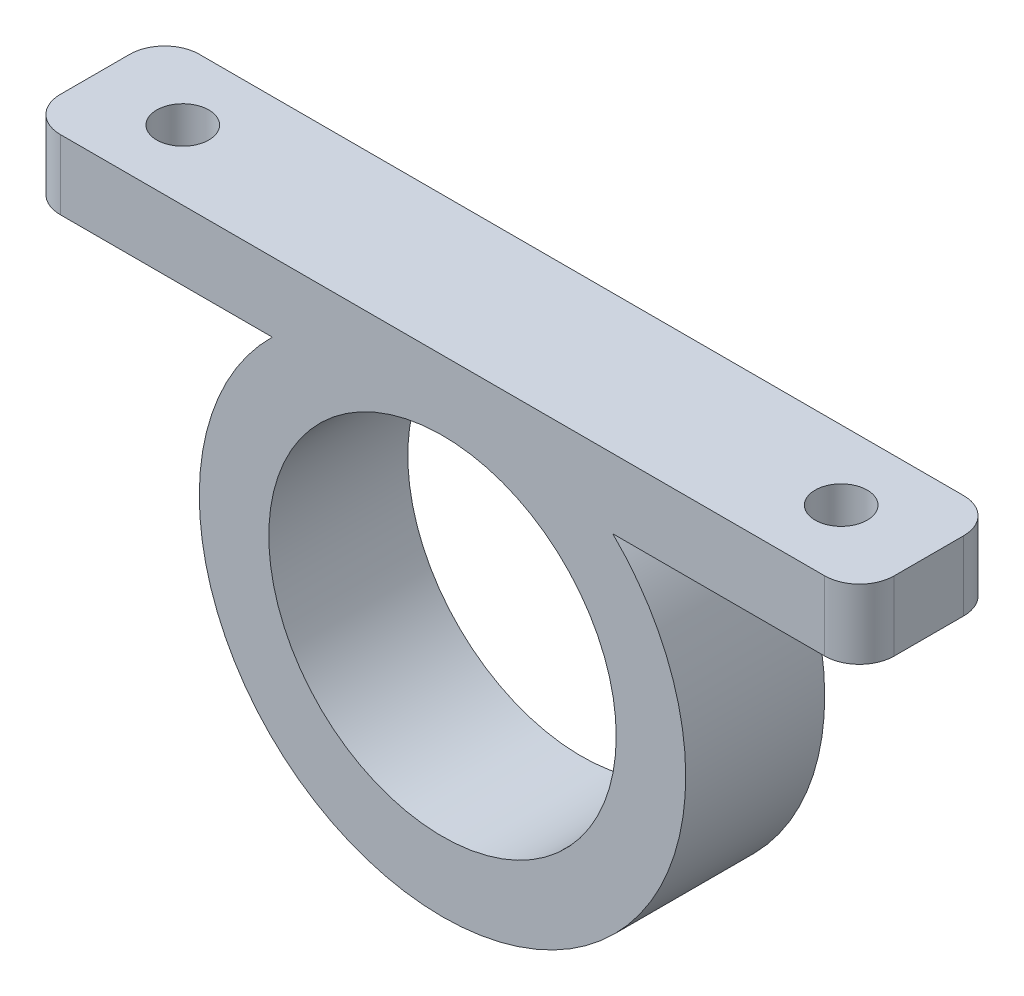
ISO-10303-21;
HEADER;
FILE_DESCRIPTION(('STEP AP214'),'2;1');
FILE_NAME('part.step','',(''),(''),'','','');
FILE_SCHEMA(('AUTOMOTIVE_DESIGN { 1 0 10303 214 1 1 1 1 }'));
ENDSEC;
DATA;
#1=APPLICATION_CONTEXT('core data for automotive mechanical design processes');
#2=APPLICATION_PROTOCOL_DEFINITION('international standard','automotive_design',2000,#1);
#3=PRODUCT_CONTEXT('',#1,'mechanical');
#4=PRODUCT('Part','Part','',(#3));
#5=PRODUCT_RELATED_PRODUCT_CATEGORY('part','',(#4));
#6=PRODUCT_DEFINITION_FORMATION('','',#4);
#7=PRODUCT_DEFINITION_CONTEXT('part definition',#1,'design');
#8=PRODUCT_DEFINITION('design','',#6,#7);
#9=PRODUCT_DEFINITION_SHAPE('','',#8);
#10=(LENGTH_UNIT() NAMED_UNIT(*) SI_UNIT(.MILLI.,.METRE.));
#11=(NAMED_UNIT(*) PLANE_ANGLE_UNIT() SI_UNIT($,.RADIAN.));
#12=(NAMED_UNIT(*) SI_UNIT($,.STERADIAN.) SOLID_ANGLE_UNIT());
#13=UNCERTAINTY_MEASURE_WITH_UNIT(LENGTH_MEASURE(1.E-05),#10,'distance_accuracy_value','');
#14=(GEOMETRIC_REPRESENTATION_CONTEXT(3) GLOBAL_UNCERTAINTY_ASSIGNED_CONTEXT((#13)) GLOBAL_UNIT_ASSIGNED_CONTEXT((#10,
#11,#12)) REPRESENTATION_CONTEXT('',''));
#15=CARTESIAN_POINT('',(0.,0.,0.));
#16=DIRECTION('',(0.,0.,1.));
#17=DIRECTION('',(1.,0.,0.));
#18=AXIS2_PLACEMENT_3D('',#15,#16,#17);
#19=CARTESIAN_POINT('',(0.,0.,8.));
#20=DIRECTION('',(0.,0.,1.));
#21=DIRECTION('',(1.,0.,0.));
#22=AXIS2_PLACEMENT_3D('',#19,#20,#21);
#23=PLANE('',#22);
#24=DIRECTION('',(1.,0.,0.));
#25=VECTOR('',#24,1.);
#26=CARTESIAN_POINT('',(24.,10.,8.));
#27=LINE('',#26,#25);
#28=CARTESIAN_POINT('',(9.79795897113272,9.99999999999999,8.));
#29=VERTEX_POINT('',#28);
#30=CARTESIAN_POINT('',(22.,10.,8.));
#31=VERTEX_POINT('',#30);
#32=EDGE_CURVE('E108',#29,#31,#27,.T.);
#33=ORIENTED_EDGE('',*,*,#32,.T.);
#34=DIRECTION('',(0.,1.,0.));
#35=VECTOR('',#34,1.);
#36=CARTESIAN_POINT('',(22.,14.,8.));
#37=LINE('',#36,#35);
#38=CARTESIAN_POINT('',(22.,14.,8.));
#39=VERTEX_POINT('',#38);
#40=EDGE_CURVE('E139',#31,#39,#37,.T.);
#41=ORIENTED_EDGE('',*,*,#40,.T.);
#42=DIRECTION('',(-1.,0.,0.));
#43=VECTOR('',#42,1.);
#44=CARTESIAN_POINT('',(0.,14.,8.));
#45=LINE('',#44,#43);
#46=CARTESIAN_POINT('',(-22.,14.,8.));
#47=VERTEX_POINT('',#46);
#48=EDGE_CURVE('E121',#39,#47,#45,.T.);
#49=ORIENTED_EDGE('',*,*,#48,.T.);
#50=DIRECTION('',(0.,-1.,0.));
#51=VECTOR('',#50,1.);
#52=CARTESIAN_POINT('',(-22.,10.,8.));
#53=LINE('',#52,#51);
#54=CARTESIAN_POINT('',(-22.,10.,8.));
#55=VERTEX_POINT('',#54);
#56=EDGE_CURVE('E136',#47,#55,#53,.T.);
#57=ORIENTED_EDGE('',*,*,#56,.T.);
#58=DIRECTION('',(1.,0.,0.));
#59=VECTOR('',#58,1.);
#60=CARTESIAN_POINT('',(-24.,10.,8.));
#61=LINE('',#60,#59);
#62=CARTESIAN_POINT('',(-9.79795897113272,10.,8.));
#63=VERTEX_POINT('',#62);
#64=EDGE_CURVE('E127',#55,#63,#61,.T.);
#65=ORIENTED_EDGE('',*,*,#64,.T.);
#66=CARTESIAN_POINT('',(0.,0.,8.));
#67=DIRECTION('',(0.,0.,1.));
#68=DIRECTION('',(1.,0.,0.));
#69=AXIS2_PLACEMENT_3D('',#66,#67,#68);
#70=CIRCLE('',#69,14.);
#71=EDGE_CURVE('E122',#63,#29,#70,.T.);
#72=ORIENTED_EDGE('',*,*,#71,.T.);
#73=EDGE_LOOP('',(#33,#41,#49,#57,#65,#72));
#74=FACE_BOUND('',#73,.T.);
#75=CARTESIAN_POINT('',(0.,0.,8.));
#76=DIRECTION('',(0.,0.,1.));
#77=DIRECTION('',(1.,0.,0.));
#78=AXIS2_PLACEMENT_3D('',#75,#76,#77);
#79=CIRCLE('',#78,10.);
#80=CARTESIAN_POINT('',(10.,0.,8.));
#81=VERTEX_POINT('',#80);
#82=EDGE_CURVE('E206',#81,#81,#79,.T.);
#83=ORIENTED_EDGE('',*,*,#82,.F.);
#84=EDGE_LOOP('',(#83));
#85=FACE_BOUND('',#84,.T.);
#86=ADVANCED_FACE('F32',(#74,#85),#23,.T.);
#87=CARTESIAN_POINT('',(0.,0.,0.));
#88=DIRECTION('',(0.,0.,1.));
#89=DIRECTION('',(1.,0.,0.));
#90=AXIS2_PLACEMENT_3D('',#87,#88,#89);
#91=PLANE('',#90);
#92=DIRECTION('',(-1.,0.,0.));
#93=VECTOR('',#92,1.);
#94=CARTESIAN_POINT('',(0.,14.,0.));
#95=LINE('',#94,#93);
#96=CARTESIAN_POINT('',(22.,14.,0.));
#97=VERTEX_POINT('',#96);
#98=CARTESIAN_POINT('',(-22.,14.,0.));
#99=VERTEX_POINT('',#98);
#100=EDGE_CURVE('E208',#97,#99,#95,.T.);
#101=ORIENTED_EDGE('',*,*,#100,.F.);
#102=DIRECTION('',(0.,1.,0.));
#103=VECTOR('',#102,1.);
#104=CARTESIAN_POINT('',(22.,0.,0.));
#105=LINE('',#104,#103);
#106=CARTESIAN_POINT('',(22.,10.,0.));
#107=VERTEX_POINT('',#106);
#108=EDGE_CURVE('E165',#97,#107,#105,.F.);
#109=ORIENTED_EDGE('',*,*,#108,.T.);
#110=DIRECTION('',(1.,0.,0.));
#111=VECTOR('',#110,1.);
#112=CARTESIAN_POINT('',(24.,10.,0.));
#113=LINE('',#112,#111);
#114=CARTESIAN_POINT('',(9.79795897113272,9.99999999999999,0.));
#115=VERTEX_POINT('',#114);
#116=EDGE_CURVE('E205',#115,#107,#113,.T.);
#117=ORIENTED_EDGE('',*,*,#116,.F.);
#118=CARTESIAN_POINT('',(0.,0.,0.));
#119=DIRECTION('',(0.,0.,1.));
#120=DIRECTION('',(1.,0.,0.));
#121=AXIS2_PLACEMENT_3D('',#118,#119,#120);
#122=CIRCLE('',#121,14.);
#123=CARTESIAN_POINT('',(-9.79795897113272,10.,0.));
#124=VERTEX_POINT('',#123);
#125=EDGE_CURVE('E135',#124,#115,#122,.T.);
#126=ORIENTED_EDGE('',*,*,#125,.F.);
#127=DIRECTION('',(1.,0.,0.));
#128=VECTOR('',#127,1.);
#129=CARTESIAN_POINT('',(-24.,10.,0.));
#130=LINE('',#129,#128);
#131=CARTESIAN_POINT('',(-22.,10.,0.));
#132=VERTEX_POINT('',#131);
#133=EDGE_CURVE('E131',#132,#124,#130,.T.);
#134=ORIENTED_EDGE('',*,*,#133,.F.);
#135=DIRECTION('',(0.,-1.,0.));
#136=VECTOR('',#135,1.);
#137=CARTESIAN_POINT('',(-22.,0.,0.));
#138=LINE('',#137,#136);
#139=EDGE_CURVE('E163',#132,#99,#138,.F.);
#140=ORIENTED_EDGE('',*,*,#139,.T.);
#141=EDGE_LOOP('',(#101,#109,#117,#126,#134,#140));
#142=FACE_BOUND('',#141,.T.);
#143=CARTESIAN_POINT('',(0.,0.,0.));
#144=DIRECTION('',(0.,0.,1.));
#145=DIRECTION('',(1.,0.,0.));
#146=AXIS2_PLACEMENT_3D('',#143,#144,#145);
#147=CIRCLE('',#146,10.);
#148=CARTESIAN_POINT('',(10.,0.,0.));
#149=VERTEX_POINT('',#148);
#150=EDGE_CURVE('E337',#149,#149,#147,.T.);
#151=ORIENTED_EDGE('',*,*,#150,.T.);
#152=EDGE_LOOP('',(#151));
#153=FACE_BOUND('',#152,.T.);
#154=ADVANCED_FACE('F210',(#142,#153),#91,.F.);
#155=CARTESIAN_POINT('',(0.,0.,8.));
#156=DIRECTION('',(0.,0.,-1.));
#157=DIRECTION('',(-1.,0.,0.));
#158=AXIS2_PLACEMENT_3D('',#155,#156,#157);
#159=CYLINDRICAL_SURFACE('',#158,14.);
#160=ORIENTED_EDGE('',*,*,#125,.T.);
#161=DIRECTION('',(0.,0.,-1.));
#162=VECTOR('',#161,1.);
#163=CARTESIAN_POINT('',(9.79795897113272,9.99999999999999,8.));
#164=LINE('',#163,#162);
#165=EDGE_CURVE('E114',#29,#115,#164,.T.);
#166=ORIENTED_EDGE('',*,*,#165,.F.);
#167=ORIENTED_EDGE('',*,*,#71,.F.);
#168=DIRECTION('',(0.,0.,-1.));
#169=VECTOR('',#168,1.);
#170=CARTESIAN_POINT('',(-9.79795897113272,10.,8.));
#171=LINE('',#170,#169);
#172=EDGE_CURVE('E180',#63,#124,#171,.T.);
#173=ORIENTED_EDGE('',*,*,#172,.T.);
#174=EDGE_LOOP('',(#160,#166,#167,#173));
#175=FACE_BOUND('',#174,.T.);
#176=ADVANCED_FACE('F133',(#175),#159,.T.);
#177=CARTESIAN_POINT('',(24.,10.,8.));
#178=DIRECTION('',(0.,1.,0.));
#179=DIRECTION('',(-1.,0.,0.));
#180=AXIS2_PLACEMENT_3D('',#177,#178,#179);
#181=PLANE('',#180);
#182=CARTESIAN_POINT('',(18.9494897427832,10.,4.));
#183=DIRECTION('',(0.,-1.,0.));
#184=DIRECTION('',(0.,0.,-1.));
#185=AXIS2_PLACEMENT_3D('',#182,#183,#184);
#186=CIRCLE('',#185,1.5);
#187=CARTESIAN_POINT('',(18.9494897427832,10.,2.5));
#188=VERTEX_POINT('',#187);
#189=EDGE_CURVE('E329',#188,#188,#186,.T.);
#190=ORIENTED_EDGE('',*,*,#189,.F.);
#191=EDGE_LOOP('',(#190));
#192=FACE_BOUND('',#191,.T.);
#193=DIRECTION('',(0.,0.,-1.));
#194=VECTOR('',#193,1.);
#195=CARTESIAN_POINT('',(24.,10.,8.));
#196=LINE('',#195,#194);
#197=CARTESIAN_POINT('',(24.,10.,6.));
#198=VERTEX_POINT('',#197);
#199=CARTESIAN_POINT('',(24.,10.,2.));
#200=VERTEX_POINT('',#199);
#201=EDGE_CURVE('E137',#198,#200,#196,.T.);
#202=ORIENTED_EDGE('',*,*,#201,.F.);
#203=CARTESIAN_POINT('',(22.,10.,6.));
#204=DIRECTION('',(0.,1.,0.));
#205=DIRECTION('',(-1.,0.,0.));
#206=AXIS2_PLACEMENT_3D('',#203,#204,#205);
#207=CIRCLE('',#206,2.);
#208=EDGE_CURVE('E117',#198,#31,#207,.F.);
#209=ORIENTED_EDGE('',*,*,#208,.T.);
#210=ORIENTED_EDGE('',*,*,#32,.F.);
#211=ORIENTED_EDGE('',*,*,#165,.T.);
#212=ORIENTED_EDGE('',*,*,#116,.T.);
#213=CARTESIAN_POINT('',(22.,9.99999999999999,2.));
#214=DIRECTION('',(0.,1.,0.));
#215=DIRECTION('',(-1.,0.,0.));
#216=AXIS2_PLACEMENT_3D('',#213,#214,#215);
#217=CIRCLE('',#216,2.);
#218=EDGE_CURVE('E160',#107,#200,#217,.F.);
#219=ORIENTED_EDGE('',*,*,#218,.T.);
#220=EDGE_LOOP('',(#202,#209,#210,#211,#212,#219));
#221=FACE_BOUND('',#220,.T.);
#222=ADVANCED_FACE('F111',(#192,#221),#181,.F.);
#223=CARTESIAN_POINT('',(24.,14.,8.));
#224=DIRECTION('',(-1.,0.,0.));
#225=DIRECTION('',(0.,0.,1.));
#226=AXIS2_PLACEMENT_3D('',#223,#224,#225);
#227=PLANE('',#226);
#228=DIRECTION('',(0.,0.,-1.));
#229=VECTOR('',#228,1.);
#230=CARTESIAN_POINT('',(24.,14.,8.));
#231=LINE('',#230,#229);
#232=CARTESIAN_POINT('',(24.,14.,6.));
#233=VERTEX_POINT('',#232);
#234=CARTESIAN_POINT('',(24.,14.,2.));
#235=VERTEX_POINT('',#234);
#236=EDGE_CURVE('E142',#233,#235,#231,.T.);
#237=ORIENTED_EDGE('',*,*,#236,.F.);
#238=DIRECTION('',(0.,1.,0.));
#239=VECTOR('',#238,1.);
#240=CARTESIAN_POINT('',(24.,10.,6.));
#241=LINE('',#240,#239);
#242=EDGE_CURVE('E158',#233,#198,#241,.F.);
#243=ORIENTED_EDGE('',*,*,#242,.T.);
#244=ORIENTED_EDGE('',*,*,#201,.T.);
#245=DIRECTION('',(0.,1.,0.));
#246=VECTOR('',#245,1.);
#247=CARTESIAN_POINT('',(24.,14.,2.));
#248=LINE('',#247,#246);
#249=EDGE_CURVE('E155',#200,#235,#248,.T.);
#250=ORIENTED_EDGE('',*,*,#249,.T.);
#251=EDGE_LOOP('',(#237,#243,#244,#250));
#252=FACE_BOUND('',#251,.T.);
#253=ADVANCED_FACE('F194',(#252),#227,.F.);
#254=CARTESIAN_POINT('',(0.,14.,8.));
#255=DIRECTION('',(0.,-1.,0.));
#256=DIRECTION('',(1.,0.,0.));
#257=AXIS2_PLACEMENT_3D('',#254,#255,#256);
#258=PLANE('',#257);
#259=CARTESIAN_POINT('',(18.9494897427832,14.,4.));
#260=DIRECTION('',(0.,-1.,0.));
#261=DIRECTION('',(0.,0.,-1.));
#262=AXIS2_PLACEMENT_3D('',#259,#260,#261);
#263=CIRCLE('',#262,1.5);
#264=CARTESIAN_POINT('',(18.9494897427832,14.,2.5));
#265=VERTEX_POINT('',#264);
#266=EDGE_CURVE('E326',#265,#265,#263,.T.);
#267=ORIENTED_EDGE('',*,*,#266,.T.);
#268=EDGE_LOOP('',(#267));
#269=FACE_BOUND('',#268,.T.);
#270=CARTESIAN_POINT('',(-18.9494897427832,14.,4.));
#271=DIRECTION('',(0.,-1.,0.));
#272=DIRECTION('',(0.,0.,-1.));
#273=AXIS2_PLACEMENT_3D('',#270,#271,#272);
#274=CIRCLE('',#273,1.5);
#275=CARTESIAN_POINT('',(-18.9494897427832,14.,2.5));
#276=VERTEX_POINT('',#275);
#277=EDGE_CURVE('E334',#276,#276,#274,.T.);
#278=ORIENTED_EDGE('',*,*,#277,.T.);
#279=EDGE_LOOP('',(#278));
#280=FACE_BOUND('',#279,.T.);
#281=ORIENTED_EDGE('',*,*,#48,.F.);
#282=CARTESIAN_POINT('',(22.,14.,6.));
#283=DIRECTION('',(0.,-1.,0.));
#284=DIRECTION('',(1.,0.,0.));
#285=AXIS2_PLACEMENT_3D('',#282,#283,#284);
#286=CIRCLE('',#285,2.);
#287=EDGE_CURVE('E153',#39,#233,#286,.F.);
#288=ORIENTED_EDGE('',*,*,#287,.T.);
#289=ORIENTED_EDGE('',*,*,#236,.T.);
#290=CARTESIAN_POINT('',(22.,14.,2.));
#291=DIRECTION('',(0.,-1.,0.));
#292=DIRECTION('',(1.,0.,0.));
#293=AXIS2_PLACEMENT_3D('',#290,#291,#292);
#294=CIRCLE('',#293,2.);
#295=EDGE_CURVE('E151',#235,#97,#294,.F.);
#296=ORIENTED_EDGE('',*,*,#295,.T.);
#297=ORIENTED_EDGE('',*,*,#100,.T.);
#298=CARTESIAN_POINT('',(-22.,14.,2.));
#299=DIRECTION('',(0.,-1.,0.));
#300=DIRECTION('',(1.,0.,0.));
#301=AXIS2_PLACEMENT_3D('',#298,#299,#300);
#302=CIRCLE('',#301,2.);
#303=CARTESIAN_POINT('',(-24.,14.,2.));
#304=VERTEX_POINT('',#303);
#305=EDGE_CURVE('E149',#99,#304,#302,.F.);
#306=ORIENTED_EDGE('',*,*,#305,.T.);
#307=DIRECTION('',(0.,0.,-1.));
#308=VECTOR('',#307,1.);
#309=CARTESIAN_POINT('',(-24.,14.,8.));
#310=LINE('',#309,#308);
#311=CARTESIAN_POINT('',(-24.,14.,6.));
#312=VERTEX_POINT('',#311);
#313=EDGE_CURVE('E176',#312,#304,#310,.T.);
#314=ORIENTED_EDGE('',*,*,#313,.F.);
#315=CARTESIAN_POINT('',(-22.,14.,6.));
#316=DIRECTION('',(0.,-1.,0.));
#317=DIRECTION('',(1.,0.,0.));
#318=AXIS2_PLACEMENT_3D('',#315,#316,#317);
#319=CIRCLE('',#318,2.);
#320=EDGE_CURVE('E147',#312,#47,#319,.F.);
#321=ORIENTED_EDGE('',*,*,#320,.T.);
#322=EDGE_LOOP('',(#281,#288,#289,#296,#297,#306,#314,#321));
#323=FACE_BOUND('',#322,.T.);
#324=ADVANCED_FACE('F189',(#269,#280,#323),#258,.F.);
#325=CARTESIAN_POINT('',(-24.,14.,8.));
#326=DIRECTION('',(1.,0.,0.));
#327=DIRECTION('',(0.,0.,-1.));
#328=AXIS2_PLACEMENT_3D('',#325,#326,#327);
#329=PLANE('',#328);
#330=ORIENTED_EDGE('',*,*,#313,.T.);
#331=DIRECTION('',(0.,-1.,0.));
#332=VECTOR('',#331,1.);
#333=CARTESIAN_POINT('',(-24.,14.,2.));
#334=LINE('',#333,#332);
#335=CARTESIAN_POINT('',(-24.,10.,2.));
#336=VERTEX_POINT('',#335);
#337=EDGE_CURVE('E169',#304,#336,#334,.T.);
#338=ORIENTED_EDGE('',*,*,#337,.T.);
#339=DIRECTION('',(0.,0.,-1.));
#340=VECTOR('',#339,1.);
#341=CARTESIAN_POINT('',(-24.,10.,8.));
#342=LINE('',#341,#340);
#343=CARTESIAN_POINT('',(-24.,10.,6.));
#344=VERTEX_POINT('',#343);
#345=EDGE_CURVE('E173',#344,#336,#342,.T.);
#346=ORIENTED_EDGE('',*,*,#345,.F.);
#347=DIRECTION('',(0.,-1.,0.));
#348=VECTOR('',#347,1.);
#349=CARTESIAN_POINT('',(-24.,14.,6.));
#350=LINE('',#349,#348);
#351=EDGE_CURVE('E167',#344,#312,#350,.F.);
#352=ORIENTED_EDGE('',*,*,#351,.T.);
#353=EDGE_LOOP('',(#330,#338,#346,#352));
#354=FACE_BOUND('',#353,.T.);
#355=ADVANCED_FACE('F172',(#354),#329,.F.);
#356=CARTESIAN_POINT('',(-24.,10.,8.));
#357=DIRECTION('',(0.,1.,0.));
#358=DIRECTION('',(0.,0.,1.));
#359=AXIS2_PLACEMENT_3D('',#356,#357,#358);
#360=PLANE('',#359);
#361=CARTESIAN_POINT('',(-18.9494897427832,10.,4.));
#362=DIRECTION('',(0.,-1.,0.));
#363=DIRECTION('',(0.,0.,-1.));
#364=AXIS2_PLACEMENT_3D('',#361,#362,#363);
#365=CIRCLE('',#364,1.5);
#366=CARTESIAN_POINT('',(-18.9494897427832,10.,2.5));
#367=VERTEX_POINT('',#366);
#368=EDGE_CURVE('E331',#367,#367,#365,.T.);
#369=ORIENTED_EDGE('',*,*,#368,.F.);
#370=EDGE_LOOP('',(#369));
#371=FACE_BOUND('',#370,.T.);
#372=ORIENTED_EDGE('',*,*,#345,.T.);
#373=CARTESIAN_POINT('',(-22.,10.,2.));
#374=DIRECTION('',(0.,1.,0.));
#375=DIRECTION('',(0.,0.,1.));
#376=AXIS2_PLACEMENT_3D('',#373,#374,#375);
#377=CIRCLE('',#376,2.);
#378=EDGE_CURVE('E11',#336,#132,#377,.F.);
#379=ORIENTED_EDGE('',*,*,#378,.T.);
#380=ORIENTED_EDGE('',*,*,#133,.T.);
#381=ORIENTED_EDGE('',*,*,#172,.F.);
#382=ORIENTED_EDGE('',*,*,#64,.F.);
#383=CARTESIAN_POINT('',(-22.,10.,6.));
#384=DIRECTION('',(0.,1.,0.));
#385=DIRECTION('',(0.,0.,1.));
#386=AXIS2_PLACEMENT_3D('',#383,#384,#385);
#387=CIRCLE('',#386,2.);
#388=EDGE_CURVE('E40',#55,#344,#387,.F.);
#389=ORIENTED_EDGE('',*,*,#388,.T.);
#390=EDGE_LOOP('',(#372,#379,#380,#381,#382,#389));
#391=FACE_BOUND('',#390,.T.);
#392=ADVANCED_FACE('F178',(#371,#391),#360,.F.);
#393=CARTESIAN_POINT('',(0.,0.,8.));
#394=DIRECTION('',(0.,0.,-1.));
#395=DIRECTION('',(-1.,0.,0.));
#396=AXIS2_PLACEMENT_3D('',#393,#394,#395);
#397=CYLINDRICAL_SURFACE('',#396,10.);
#398=ORIENTED_EDGE('',*,*,#82,.T.);
#399=EDGE_LOOP('',(#398));
#400=FACE_BOUND('',#399,.T.);
#401=ORIENTED_EDGE('',*,*,#150,.F.);
#402=EDGE_LOOP('',(#401));
#403=FACE_BOUND('',#402,.T.);
#404=ADVANCED_FACE('F223',(#400,#403),#397,.F.);
#405=CARTESIAN_POINT('',(22.,0.,6.));
#406=DIRECTION('',(0.,-1.,0.));
#407=DIRECTION('',(0.,0.,-1.));
#408=AXIS2_PLACEMENT_3D('',#405,#406,#407);
#409=CYLINDRICAL_SURFACE('',#408,2.);
#410=ORIENTED_EDGE('',*,*,#208,.F.);
#411=ORIENTED_EDGE('',*,*,#242,.F.);
#412=ORIENTED_EDGE('',*,*,#287,.F.);
#413=ORIENTED_EDGE('',*,*,#40,.F.);
#414=EDGE_LOOP('',(#410,#411,#412,#413));
#415=FACE_BOUND('',#414,.T.);
#416=ADVANCED_FACE('F197',(#415),#409,.T.);
#417=CARTESIAN_POINT('',(22.,14.,2.));
#418=DIRECTION('',(0.,1.,0.));
#419=DIRECTION('',(0.,0.,1.));
#420=AXIS2_PLACEMENT_3D('',#417,#418,#419);
#421=CYLINDRICAL_SURFACE('',#420,2.);
#422=ORIENTED_EDGE('',*,*,#218,.F.);
#423=ORIENTED_EDGE('',*,*,#108,.F.);
#424=ORIENTED_EDGE('',*,*,#295,.F.);
#425=ORIENTED_EDGE('',*,*,#249,.F.);
#426=EDGE_LOOP('',(#422,#423,#424,#425));
#427=FACE_BOUND('',#426,.T.);
#428=ADVANCED_FACE('F215',(#427),#421,.T.);
#429=CARTESIAN_POINT('',(-22.,14.,2.));
#430=DIRECTION('',(0.,-1.,0.));
#431=DIRECTION('',(0.,0.,-1.));
#432=AXIS2_PLACEMENT_3D('',#429,#430,#431);
#433=CYLINDRICAL_SURFACE('',#432,2.);
#434=ORIENTED_EDGE('',*,*,#305,.F.);
#435=ORIENTED_EDGE('',*,*,#139,.F.);
#436=ORIENTED_EDGE('',*,*,#378,.F.);
#437=ORIENTED_EDGE('',*,*,#337,.F.);
#438=EDGE_LOOP('',(#434,#435,#436,#437));
#439=FACE_BOUND('',#438,.T.);
#440=ADVANCED_FACE('F217',(#439),#433,.T.);
#441=CARTESIAN_POINT('',(-22.,0.,6.));
#442=DIRECTION('',(0.,1.,0.));
#443=DIRECTION('',(0.,0.,1.));
#444=AXIS2_PLACEMENT_3D('',#441,#442,#443);
#445=CYLINDRICAL_SURFACE('',#444,2.);
#446=ORIENTED_EDGE('',*,*,#320,.F.);
#447=ORIENTED_EDGE('',*,*,#351,.F.);
#448=ORIENTED_EDGE('',*,*,#388,.F.);
#449=ORIENTED_EDGE('',*,*,#56,.F.);
#450=EDGE_LOOP('',(#446,#447,#448,#449));
#451=FACE_BOUND('',#450,.T.);
#452=ADVANCED_FACE('F34',(#451),#445,.T.);
#453=CARTESIAN_POINT('',(-18.9494897427832,14.,4.));
#454=DIRECTION('',(0.,-1.,0.));
#455=DIRECTION('',(0.,0.,-1.));
#456=AXIS2_PLACEMENT_3D('',#453,#454,#455);
#457=CYLINDRICAL_SURFACE('',#456,1.5);
#458=ORIENTED_EDGE('',*,*,#277,.F.);
#459=EDGE_LOOP('',(#458));
#460=FACE_BOUND('',#459,.T.);
#461=ORIENTED_EDGE('',*,*,#368,.T.);
#462=EDGE_LOOP('',(#461));
#463=FACE_BOUND('',#462,.T.);
#464=ADVANCED_FACE('F301',(#460,#463),#457,.F.);
#465=CARTESIAN_POINT('',(18.9494897427832,14.,4.));
#466=DIRECTION('',(0.,-1.,0.));
#467=DIRECTION('',(0.,0.,-1.));
#468=AXIS2_PLACEMENT_3D('',#465,#466,#467);
#469=CYLINDRICAL_SURFACE('',#468,1.5);
#470=ORIENTED_EDGE('',*,*,#266,.F.);
#471=EDGE_LOOP('',(#470));
#472=FACE_BOUND('',#471,.T.);
#473=ORIENTED_EDGE('',*,*,#189,.T.);
#474=EDGE_LOOP('',(#473));
#475=FACE_BOUND('',#474,.T.);
#476=ADVANCED_FACE('F310',(#472,#475),#469,.F.);
#477=CLOSED_SHELL('',(#86,#154,#176,#222,#253,#324,#355,#392,#404,#416,#428,#440,#452,#464,#476));
#478=MANIFOLD_SOLID_BREP('B2',#477);
#479=ADVANCED_BREP_SHAPE_REPRESENTATION('',(#18,#478),#14);
#480=SHAPE_DEFINITION_REPRESENTATION(#9,#479);
ENDSEC;
END-ISO-10303-21;
